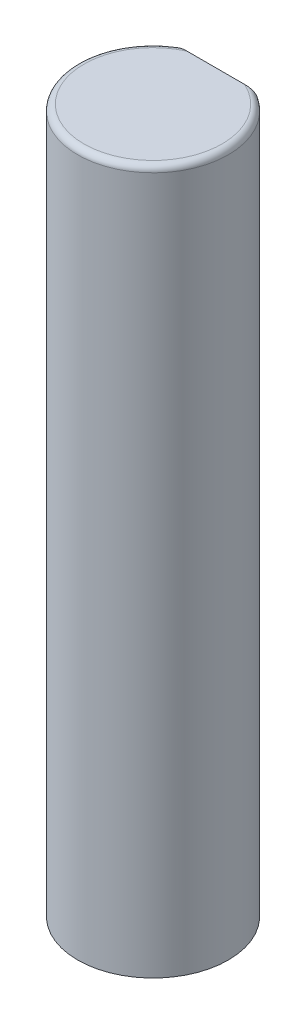
ISO-10303-21;
HEADER;
FILE_DESCRIPTION(('STEP AP214'),'2;1');
FILE_NAME('part.step','',(''),(''),'','','');
FILE_SCHEMA(('AUTOMOTIVE_DESIGN { 1 0 10303 214 1 1 1 1 }'));
ENDSEC;
DATA;
#1=APPLICATION_CONTEXT('core data for automotive mechanical design processes');
#2=APPLICATION_PROTOCOL_DEFINITION('international standard','automotive_design',2000,#1);
#3=PRODUCT_CONTEXT('',#1,'mechanical');
#4=PRODUCT('Part','Part','',(#3));
#5=PRODUCT_RELATED_PRODUCT_CATEGORY('part','',(#4));
#6=PRODUCT_DEFINITION_FORMATION('','',#4);
#7=PRODUCT_DEFINITION_CONTEXT('part definition',#1,'design');
#8=PRODUCT_DEFINITION('design','',#6,#7);
#9=PRODUCT_DEFINITION_SHAPE('','',#8);
#10=(LENGTH_UNIT() NAMED_UNIT(*) SI_UNIT(.MILLI.,.METRE.));
#11=(NAMED_UNIT(*) PLANE_ANGLE_UNIT() SI_UNIT($,.RADIAN.));
#12=(NAMED_UNIT(*) SI_UNIT($,.STERADIAN.) SOLID_ANGLE_UNIT());
#13=UNCERTAINTY_MEASURE_WITH_UNIT(LENGTH_MEASURE(1.E-05),#10,'distance_accuracy_value','');
#14=(GEOMETRIC_REPRESENTATION_CONTEXT(3) GLOBAL_UNCERTAINTY_ASSIGNED_CONTEXT((#13)) GLOBAL_UNIT_ASSIGNED_CONTEXT((#10,
#11,#12)) REPRESENTATION_CONTEXT('',''));
#15=CARTESIAN_POINT('',(0.,0.,0.));
#16=DIRECTION('',(0.,0.,1.));
#17=DIRECTION('',(1.,0.,0.));
#18=AXIS2_PLACEMENT_3D('',#15,#16,#17);
#19=CARTESIAN_POINT('',(0.,28.,0.));
#20=DIRECTION('',(0.,-1.,0.));
#21=DIRECTION('',(0.,0.,-1.));
#22=AXIS2_PLACEMENT_3D('',#19,#20,#21);
#23=CYLINDRICAL_SURFACE('',#22,3.);
#24=DIRECTION('',(0.,-1.,0.));
#25=VECTOR('',#24,1.);
#26=CARTESIAN_POINT('',(1.6583123951777,28.,-2.5));
#27=LINE('',#26,#25);
#28=CARTESIAN_POINT('',(1.6583123951777,16.,-2.5));
#29=VERTEX_POINT('',#28);
#30=CARTESIAN_POINT('',(1.6583123951777,27.75,-2.5));
#31=VERTEX_POINT('',#30);
#32=EDGE_CURVE('E73',#29,#31,#27,.F.);
#33=ORIENTED_EDGE('',*,*,#32,.T.);
#34=CARTESIAN_POINT('',(0.,27.75,0.));
#35=DIRECTION('',(0.,1.,0.));
#36=DIRECTION('',(0.,0.,1.));
#37=AXIS2_PLACEMENT_3D('',#34,#35,#36);
#38=CIRCLE('',#37,3.);
#39=CARTESIAN_POINT('',(-1.6583123951777,27.75,-2.5));
#40=VERTEX_POINT('',#39);
#41=EDGE_CURVE('E11',#31,#40,#38,.F.);
#42=ORIENTED_EDGE('',*,*,#41,.T.);
#43=DIRECTION('',(0.,-1.,0.));
#44=VECTOR('',#43,1.);
#45=CARTESIAN_POINT('',(-1.6583123951777,28.,-2.5));
#46=LINE('',#45,#44);
#47=CARTESIAN_POINT('',(-1.6583123951777,16.,-2.5));
#48=VERTEX_POINT('',#47);
#49=EDGE_CURVE('E66',#40,#48,#46,.T.);
#50=ORIENTED_EDGE('',*,*,#49,.T.);
#51=CARTESIAN_POINT('',(0.,16.,0.));
#52=DIRECTION('',(0.,1.,0.));
#53=DIRECTION('',(0.,0.,1.));
#54=AXIS2_PLACEMENT_3D('',#51,#52,#53);
#55=CIRCLE('',#54,3.);
#56=EDGE_CURVE('E69',#29,#48,#55,.T.);
#57=ORIENTED_EDGE('',*,*,#56,.F.);
#58=EDGE_LOOP('',(#33,#42,#50,#57));
#59=FACE_BOUND('',#58,.T.);
#60=CARTESIAN_POINT('',(0.,0.,0.));
#61=DIRECTION('',(0.,1.,0.));
#62=DIRECTION('',(0.,0.,1.));
#63=AXIS2_PLACEMENT_3D('',#60,#61,#62);
#64=CIRCLE('',#63,3.);
#65=CARTESIAN_POINT('',(0.,0.,3.));
#66=VERTEX_POINT('',#65);
#67=EDGE_CURVE('E72',#66,#66,#64,.T.);
#68=ORIENTED_EDGE('',*,*,#67,.T.);
#69=EDGE_LOOP('',(#68));
#70=FACE_BOUND('',#69,.T.);
#71=ADVANCED_FACE('F35',(#59,#70),#23,.T.);
#72=CARTESIAN_POINT('',(0.,28.,0.));
#73=DIRECTION('',(0.,1.,0.));
#74=DIRECTION('',(0.,0.,1.));
#75=AXIS2_PLACEMENT_3D('',#72,#73,#74);
#76=PLANE('',#75);
#77=DIRECTION('',(1.,0.,0.));
#78=VECTOR('',#77,1.);
#79=CARTESIAN_POINT('',(0.,28.,-2.5));
#80=LINE('',#79,#78);
#81=CARTESIAN_POINT('',(-1.14564392373896,28.,-2.5));
#82=VERTEX_POINT('',#81);
#83=CARTESIAN_POINT('',(1.14564392373896,28.,-2.5));
#84=VERTEX_POINT('',#83);
#85=EDGE_CURVE('E80',#82,#84,#80,.T.);
#86=ORIENTED_EDGE('',*,*,#85,.F.);
#87=CARTESIAN_POINT('',(0.,28.,0.));
#88=DIRECTION('',(0.,1.,0.));
#89=DIRECTION('',(0.,0.,1.));
#90=AXIS2_PLACEMENT_3D('',#87,#88,#89);
#91=CIRCLE('',#90,2.75);
#92=EDGE_CURVE('E79',#82,#84,#91,.T.);
#93=ORIENTED_EDGE('',*,*,#92,.T.);
#94=EDGE_LOOP('',(#86,#93));
#95=FACE_BOUND('',#94,.T.);
#96=ADVANCED_FACE('F103',(#95),#76,.T.);
#97=CARTESIAN_POINT('',(0.,0.,0.));
#98=DIRECTION('',(0.,1.,0.));
#99=DIRECTION('',(0.,0.,1.));
#100=AXIS2_PLACEMENT_3D('',#97,#98,#99);
#101=PLANE('',#100);
#102=ORIENTED_EDGE('',*,*,#67,.F.);
#103=EDGE_LOOP('',(#102));
#104=FACE_BOUND('',#103,.T.);
#105=ADVANCED_FACE('F107',(#104),#101,.F.);
#106=CARTESIAN_POINT('',(0.,16.,0.));
#107=DIRECTION('',(0.,1.,0.));
#108=DIRECTION('',(0.,0.,1.));
#109=AXIS2_PLACEMENT_3D('',#106,#107,#108);
#110=PLANE('',#109);
#111=ORIENTED_EDGE('',*,*,#56,.T.);
#112=DIRECTION('',(1.,0.,0.));
#113=VECTOR('',#112,1.);
#114=CARTESIAN_POINT('',(3.,16.,-2.5));
#115=LINE('',#114,#113);
#116=EDGE_CURVE('E78',#48,#29,#115,.T.);
#117=ORIENTED_EDGE('',*,*,#116,.T.);
#118=EDGE_LOOP('',(#111,#117));
#119=FACE_BOUND('',#118,.T.);
#120=ADVANCED_FACE('F77',(#119),#110,.T.);
#121=CARTESIAN_POINT('',(3.,16.,-2.5));
#122=DIRECTION('',(0.,0.,1.));
#123=DIRECTION('',(1.,0.,0.));
#124=AXIS2_PLACEMENT_3D('',#121,#122,#123);
#125=PLANE('',#124);
#126=ORIENTED_EDGE('',*,*,#85,.T.);
#127=CARTESIAN_POINT('',(1.14564392373896,28.,-2.5));
#128=CARTESIAN_POINT('',(1.16987018526803,27.9999889555273,-2.5));
#129=CARTESIAN_POINT('',(1.19411365506943,27.9993873445077,-2.5));
#130=CARTESIAN_POINT('',(1.24263432662497,27.9967324466369,-2.5));
#131=CARTESIAN_POINT('',(1.26691113749494,27.9946722476899,-2.5));
#132=CARTESIAN_POINT('',(1.31551010623515,27.9887949310318,-2.5));
#133=CARTESIAN_POINT('',(1.33983021785743,27.98496017192,-2.5));
#134=CARTESIAN_POINT('',(1.3880008922853,27.9751477598151,-2.5));
#135=CARTESIAN_POINT('',(1.41185235547475,27.9691747511505,-2.5));
#136=CARTESIAN_POINT('',(1.45059386995194,27.9570897382756,-2.5));
#137=CARTESIAN_POINT('',(1.46572205063426,27.9517449153692,-2.5));
#138=CARTESIAN_POINT('',(1.4954381153375,27.9397125348802,-2.5));
#139=CARTESIAN_POINT('',(1.51002624157894,27.9330255881133,-2.5));
#140=CARTESIAN_POINT('',(1.53849563211052,27.9179992501816,-2.5));
#141=CARTESIAN_POINT('',(1.55236995156816,27.9096464861602,-2.5));
#142=CARTESIAN_POINT('',(1.57877832053975,27.8910202379861,-2.5));
#143=CARTESIAN_POINT('',(1.59131493081603,27.8807505309885,-2.5));
#144=CARTESIAN_POINT('',(1.60991780957099,27.8622751054224,-2.5));
#145=CARTESIAN_POINT('',(1.61664718657261,27.8547401624507,-2.5));
#146=CARTESIAN_POINT('',(1.62895489981886,27.8387724843733,-2.5));
#147=CARTESIAN_POINT('',(1.63453423540192,27.8303405384696,-2.5));
#148=CARTESIAN_POINT('',(1.6434596302741,27.8139402217592,-2.5));
#149=CARTESIAN_POINT('',(1.64701339174145,27.8060858244571,-2.5));
#150=CARTESIAN_POINT('',(1.65275826670512,27.7898984429247,-2.5));
#151=CARTESIAN_POINT('',(1.65495256510753,27.7815666276341,-2.5));
#152=CARTESIAN_POINT('',(1.65701665699405,27.7692962544355,-2.5));
#153=CARTESIAN_POINT('',(1.65750128607551,27.7654543951588,-2.5));
#154=CARTESIAN_POINT('',(1.65814943536677,27.7577424191593,-2.5));
#155=CARTESIAN_POINT('',(1.65831284547912,27.7538722932043,-2.5));
#156=CARTESIAN_POINT('',(1.65831239517809,27.7500000000001,-2.5));
#157=B_SPLINE_CURVE_WITH_KNOTS('',3,(#127,#128,#129,#130,#131,#132,#133,#134,#135,#136,#137,
#138,#139,#140,#141,#142,#143,#144,#145,#146,#147,#148,#149,#150,#151,#152,#153,#154,#155,#156),
.UNSPECIFIED.,.F.,.F.,(4,2,2,2,2,2,2,2,2,2,2,2,2,2,4),(0.,0.0726981413525272,0.145743117721036,
0.219530391665572,0.293158360740909,0.34124179266078,0.389303390685413,0.437767587625879,
0.486137279645094,0.516363244813474,0.546562833100338,0.572324383907304,0.598025350875031,
0.609630664504588,0.621239955149483),.UNSPECIFIED.);
#158=EDGE_CURVE('E44',#84,#31,#157,.T.);
#159=ORIENTED_EDGE('',*,*,#158,.T.);
#160=ORIENTED_EDGE('',*,*,#32,.F.);
#161=ORIENTED_EDGE('',*,*,#116,.F.);
#162=ORIENTED_EDGE('',*,*,#49,.F.);
#163=CARTESIAN_POINT('',(-1.6583123951777,27.75,-2.5));
#164=CARTESIAN_POINT('',(-1.65834581263898,27.7597858089112,-2.5));
#165=CARTESIAN_POINT('',(-1.65727539986383,27.7695272500328,-2.5));
#166=CARTESIAN_POINT('',(-1.65323745539569,27.7884815612476,-2.5));
#167=CARTESIAN_POINT('',(-1.65029509572377,27.7976997031631,-2.5));
#168=CARTESIAN_POINT('',(-1.64282908836353,27.8153953449013,-2.5));
#169=CARTESIAN_POINT('',(-1.63831377882529,27.8238764611559,-2.5));
#170=CARTESIAN_POINT('',(-1.62803689430569,27.8400716325004,-2.5));
#171=CARTESIAN_POINT('',(-1.62227095184316,27.8477828575425,-2.5));
#172=CARTESIAN_POINT('',(-1.60628591012214,27.8665169246763,-2.5));
#173=CARTESIAN_POINT('',(-1.59538818702617,27.8769576756166,-2.5));
#174=CARTESIAN_POINT('',(-1.57214313939093,27.8960468311749,-2.5));
#175=CARTESIAN_POINT('',(-1.55979314314561,27.9046918488176,-2.5));
#176=CARTESIAN_POINT('',(-1.52473575478151,27.9262490206145,-2.5));
#177=CARTESIAN_POINT('',(-1.50109106692807,27.9376233545217,-2.5));
#178=CARTESIAN_POINT('',(-1.45235914574662,27.9569211683241,-2.5));
#179=CARTESIAN_POINT('',(-1.42726398807334,27.9648231603475,-2.5));
#180=CARTESIAN_POINT('',(-1.3807156432626,27.9767713494665,-2.5));
#181=CARTESIAN_POINT('',(-1.35936863900058,27.9812446803386,-2.5));
#182=CARTESIAN_POINT('',(-1.3163872261249,27.9886236333853,-2.5));
#183=CARTESIAN_POINT('',(-1.2947525227236,27.9915274962716,-2.5));
#184=CARTESIAN_POINT('',(-1.25186679547002,27.9959563191186,-2.5));
#185=CARTESIAN_POINT('',(-1.23061883819675,27.9975123430629,-2.5));
#186=CARTESIAN_POINT('',(-1.18812549824039,27.9995296828575,-2.5));
#187=CARTESIAN_POINT('',(-1.16688025546058,27.9999938640848,-2.5));
#188=CARTESIAN_POINT('',(-1.14564392373896,28.,-2.5));
#189=B_SPLINE_CURVE_WITH_KNOTS('',3,(#163,#164,#165,#166,#167,#168,#169,#170,#171,#172,#173,
#174,#175,#176,#177,#178,#179,#180,#181,#182,#183,#184,#185,#186,#187,#188),.UNSPECIFIED.,.F.,
.F.,(4,2,2,2,2,2,2,2,2,2,2,2,4),(0.,0.0292288343250234,0.058072705120814,0.0867659455647831,
0.115561050392442,0.160580187605773,0.205683480555699,0.283958581307432,0.362711474683906,
0.428075284280958,0.493512211991868,0.557397490817889,0.621114924372789),.UNSPECIFIED.);
#190=EDGE_CURVE('E91',#40,#82,#189,.T.);
#191=ORIENTED_EDGE('',*,*,#190,.T.);
#192=EDGE_LOOP('',(#126,#159,#160,#161,#162,#191));
#193=FACE_BOUND('',#192,.T.);
#194=ADVANCED_FACE('F82',(#193),#125,.F.);
#195=CARTESIAN_POINT('',(0.,27.75,0.));
#196=DIRECTION('',(0.,1.,0.));
#197=DIRECTION('',(0.,0.,1.));
#198=AXIS2_PLACEMENT_3D('',#195,#196,#197);
#199=TOROIDAL_SURFACE('',#198,2.75,0.25);
#200=ORIENTED_EDGE('',*,*,#190,.F.);
#201=ORIENTED_EDGE('',*,*,#41,.F.);
#202=ORIENTED_EDGE('',*,*,#158,.F.);
#203=ORIENTED_EDGE('',*,*,#92,.F.);
#204=EDGE_LOOP('',(#200,#201,#202,#203));
#205=FACE_BOUND('',#204,.T.);
#206=ADVANCED_FACE('F37',(#205),#199,.T.);
#207=CLOSED_SHELL('',(#71,#96,#105,#120,#194,#206));
#208=MANIFOLD_SOLID_BREP('B2',#207);
#209=ADVANCED_BREP_SHAPE_REPRESENTATION('',(#18,#208),#14);
#210=SHAPE_DEFINITION_REPRESENTATION(#9,#209);
ENDSEC;
END-ISO-10303-21;
